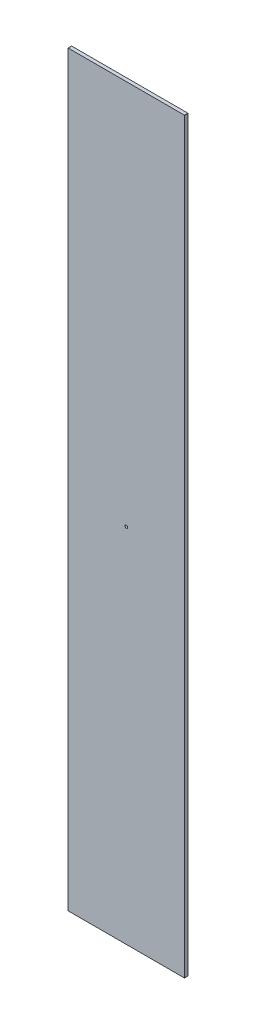
ISO-10303-21;
HEADER;
FILE_DESCRIPTION(('STEP AP214'),'2;1');
FILE_NAME('part.step','',(''),(''),'','','');
FILE_SCHEMA(('AUTOMOTIVE_DESIGN { 1 0 10303 214 1 1 1 1 }'));
ENDSEC;
DATA;
#1=APPLICATION_CONTEXT('core data for automotive mechanical design processes');
#2=APPLICATION_PROTOCOL_DEFINITION('international standard','automotive_design',2000,#1);
#3=PRODUCT_CONTEXT('',#1,'mechanical');
#4=PRODUCT('Part','Part','',(#3));
#5=PRODUCT_RELATED_PRODUCT_CATEGORY('part','',(#4));
#6=PRODUCT_DEFINITION_FORMATION('','',#4);
#7=PRODUCT_DEFINITION_CONTEXT('part definition',#1,'design');
#8=PRODUCT_DEFINITION('design','',#6,#7);
#9=PRODUCT_DEFINITION_SHAPE('','',#8);
#10=(LENGTH_UNIT() NAMED_UNIT(*) SI_UNIT(.MILLI.,.METRE.));
#11=(NAMED_UNIT(*) PLANE_ANGLE_UNIT() SI_UNIT($,.RADIAN.));
#12=(NAMED_UNIT(*) SI_UNIT($,.STERADIAN.) SOLID_ANGLE_UNIT());
#13=UNCERTAINTY_MEASURE_WITH_UNIT(LENGTH_MEASURE(1.E-05),#10,'distance_accuracy_value','');
#14=(GEOMETRIC_REPRESENTATION_CONTEXT(3) GLOBAL_UNCERTAINTY_ASSIGNED_CONTEXT((#13)) GLOBAL_UNIT_ASSIGNED_CONTEXT((#10,
#11,#12)) REPRESENTATION_CONTEXT('',''));
#15=CARTESIAN_POINT('',(0.,0.,0.));
#16=DIRECTION('',(0.,0.,1.));
#17=DIRECTION('',(1.,0.,0.));
#18=AXIS2_PLACEMENT_3D('',#15,#16,#17);
#19=CARTESIAN_POINT('',(-107.17079593887,-782.6375,6.35));
#20=DIRECTION('',(1.,0.,0.));
#21=DIRECTION('',(0.,0.,-1.));
#22=AXIS2_PLACEMENT_3D('',#19,#20,#21);
#23=PLANE('',#22);
#24=DIRECTION('',(0.,-1.,0.));
#25=VECTOR('',#24,1.);
#26=CARTESIAN_POINT('',(-107.17079593887,-782.6375,0.));
#27=LINE('',#26,#25);
#28=CARTESIAN_POINT('',(-107.17079593887,591.6041,0.));
#29=VERTEX_POINT('',#28);
#30=CARTESIAN_POINT('',(-107.17079593887,-782.3835,0.));
#31=VERTEX_POINT('',#30);
#32=EDGE_CURVE('E139',#29,#31,#27,.T.);
#33=ORIENTED_EDGE('',*,*,#32,.T.);
#34=DIRECTION('',(0.,0.,-1.));
#35=VECTOR('',#34,1.);
#36=CARTESIAN_POINT('',(-107.17079593887,-782.3835,6.35));
#37=LINE('',#36,#35);
#38=CARTESIAN_POINT('',(-107.17079593887,-782.3835,6.35));
#39=VERTEX_POINT('',#38);
#40=EDGE_CURVE('E114',#31,#39,#37,.F.);
#41=ORIENTED_EDGE('',*,*,#40,.T.);
#42=DIRECTION('',(0.,-1.,0.));
#43=VECTOR('',#42,1.);
#44=CARTESIAN_POINT('',(-107.17079593887,-782.6375,6.35));
#45=LINE('',#44,#43);
#46=CARTESIAN_POINT('',(-107.17079593887,591.6041,6.35));
#47=VERTEX_POINT('',#46);
#48=EDGE_CURVE('E153',#47,#39,#45,.T.);
#49=ORIENTED_EDGE('',*,*,#48,.F.);
#50=DIRECTION('',(0.,0.,-1.));
#51=VECTOR('',#50,1.);
#52=CARTESIAN_POINT('',(-107.17079593887,591.6041,6.35));
#53=LINE('',#52,#51);
#54=EDGE_CURVE('E120',#47,#29,#53,.T.);
#55=ORIENTED_EDGE('',*,*,#54,.T.);
#56=EDGE_LOOP('',(#33,#41,#49,#55));
#57=FACE_BOUND('',#56,.T.);
#58=ADVANCED_FACE('F42',(#57),#23,.F.);
#59=CARTESIAN_POINT('',(-107.17079593887,-782.6375,6.35));
#60=DIRECTION('',(0.,1.,0.));
#61=DIRECTION('',(0.,0.,1.));
#62=AXIS2_PLACEMENT_3D('',#59,#60,#61);
#63=PLANE('',#62);
#64=DIRECTION('',(1.,0.,0.));
#65=VECTOR('',#64,1.);
#66=CARTESIAN_POINT('',(-107.17079593887,-782.6375,6.35));
#67=LINE('',#66,#65);
#68=CARTESIAN_POINT('',(-106.91679593887,-782.6375,6.35));
#69=VERTEX_POINT('',#68);
#70=CARTESIAN_POINT('',(106.91679593887,-782.6375,6.35));
#71=VERTEX_POINT('',#70);
#72=EDGE_CURVE('E130',#69,#71,#67,.T.);
#73=ORIENTED_EDGE('',*,*,#72,.F.);
#74=DIRECTION('',(0.,0.,-1.));
#75=VECTOR('',#74,1.);
#76=CARTESIAN_POINT('',(-106.91679593887,-782.6375,6.35));
#77=LINE('',#76,#75);
#78=CARTESIAN_POINT('',(-106.91679593887,-782.6375,0.));
#79=VERTEX_POINT('',#78);
#80=EDGE_CURVE('E113',#69,#79,#77,.T.);
#81=ORIENTED_EDGE('',*,*,#80,.T.);
#82=DIRECTION('',(1.,0.,0.));
#83=VECTOR('',#82,1.);
#84=CARTESIAN_POINT('',(-107.17079593887,-782.6375,0.));
#85=LINE('',#84,#83);
#86=CARTESIAN_POINT('',(106.91679593887,-782.6375,0.));
#87=VERTEX_POINT('',#86);
#88=EDGE_CURVE('E127',#79,#87,#85,.T.);
#89=ORIENTED_EDGE('',*,*,#88,.T.);
#90=DIRECTION('',(0.,0.,-1.));
#91=VECTOR('',#90,1.);
#92=CARTESIAN_POINT('',(106.916795938871,-782.6375,6.35));
#93=LINE('',#92,#91);
#94=EDGE_CURVE('E133',#87,#71,#93,.F.);
#95=ORIENTED_EDGE('',*,*,#94,.T.);
#96=EDGE_LOOP('',(#73,#81,#89,#95));
#97=FACE_BOUND('',#96,.T.);
#98=ADVANCED_FACE('F126',(#97),#63,.F.);
#99=CARTESIAN_POINT('',(107.170795938871,-782.6375,6.35));
#100=DIRECTION('',(-1.,0.,0.));
#101=DIRECTION('',(0.,-1.,0.));
#102=AXIS2_PLACEMENT_3D('',#99,#100,#101);
#103=PLANE('',#102);
#104=DIRECTION('',(0.,1.,0.));
#105=VECTOR('',#104,1.);
#106=CARTESIAN_POINT('',(107.170795938871,-782.6375,6.35));
#107=LINE('',#106,#105);
#108=CARTESIAN_POINT('',(107.170795938871,-782.3835,6.35));
#109=VERTEX_POINT('',#108);
#110=CARTESIAN_POINT('',(107.17079593887,591.6041,6.35));
#111=VERTEX_POINT('',#110);
#112=EDGE_CURVE('E206',#109,#111,#107,.T.);
#113=ORIENTED_EDGE('',*,*,#112,.F.);
#114=DIRECTION('',(0.,0.,-1.));
#115=VECTOR('',#114,1.);
#116=CARTESIAN_POINT('',(107.170795938871,-782.3835,6.35));
#117=LINE('',#116,#115);
#118=CARTESIAN_POINT('',(107.170795938871,-782.3835,0.));
#119=VERTEX_POINT('',#118);
#120=EDGE_CURVE('E183',#109,#119,#117,.T.);
#121=ORIENTED_EDGE('',*,*,#120,.T.);
#122=DIRECTION('',(0.,1.,0.));
#123=VECTOR('',#122,1.);
#124=CARTESIAN_POINT('',(107.170795938871,-782.6375,0.));
#125=LINE('',#124,#123);
#126=CARTESIAN_POINT('',(107.17079593887,591.6041,0.));
#127=VERTEX_POINT('',#126);
#128=EDGE_CURVE('E138',#119,#127,#125,.T.);
#129=ORIENTED_EDGE('',*,*,#128,.T.);
#130=DIRECTION('',(0.,0.,-1.));
#131=VECTOR('',#130,1.);
#132=CARTESIAN_POINT('',(107.17079593887,591.6041,6.35));
#133=LINE('',#132,#131);
#134=EDGE_CURVE('E180',#127,#111,#133,.F.);
#135=ORIENTED_EDGE('',*,*,#134,.T.);
#136=EDGE_LOOP('',(#113,#121,#129,#135));
#137=FACE_BOUND('',#136,.T.);
#138=ADVANCED_FACE('F245',(#137),#103,.F.);
#139=CARTESIAN_POINT('',(-107.17079593887,591.8581,6.35));
#140=DIRECTION('',(0.,-1.,0.));
#141=DIRECTION('',(0.,0.,-1.));
#142=AXIS2_PLACEMENT_3D('',#139,#140,#141);
#143=PLANE('',#142);
#144=DIRECTION('',(-1.,0.,0.));
#145=VECTOR('',#144,1.);
#146=CARTESIAN_POINT('',(-107.17079593887,591.8581,6.35));
#147=LINE('',#146,#145);
#148=CARTESIAN_POINT('',(106.91679593887,591.8581,6.35));
#149=VERTEX_POINT('',#148);
#150=CARTESIAN_POINT('',(-106.91679593887,591.8581,6.35));
#151=VERTEX_POINT('',#150);
#152=EDGE_CURVE('E155',#149,#151,#147,.T.);
#153=ORIENTED_EDGE('',*,*,#152,.F.);
#154=DIRECTION('',(0.,0.,-1.));
#155=VECTOR('',#154,1.);
#156=CARTESIAN_POINT('',(106.91679593887,591.8581,6.35));
#157=LINE('',#156,#155);
#158=CARTESIAN_POINT('',(106.91679593887,591.8581,0.));
#159=VERTEX_POINT('',#158);
#160=EDGE_CURVE('E11',#149,#159,#157,.T.);
#161=ORIENTED_EDGE('',*,*,#160,.T.);
#162=DIRECTION('',(-1.,0.,0.));
#163=VECTOR('',#162,1.);
#164=CARTESIAN_POINT('',(-107.17079593887,591.8581,0.));
#165=LINE('',#164,#163);
#166=CARTESIAN_POINT('',(-106.91679593887,591.8581,0.));
#167=VERTEX_POINT('',#166);
#168=EDGE_CURVE('E145',#159,#167,#165,.T.);
#169=ORIENTED_EDGE('',*,*,#168,.T.);
#170=DIRECTION('',(0.,0.,-1.));
#171=VECTOR('',#170,1.);
#172=CARTESIAN_POINT('',(-106.91679593887,591.8581,6.35));
#173=LINE('',#172,#171);
#174=EDGE_CURVE('E51',#167,#151,#173,.F.);
#175=ORIENTED_EDGE('',*,*,#174,.T.);
#176=EDGE_LOOP('',(#153,#161,#169,#175));
#177=FACE_BOUND('',#176,.T.);
#178=ADVANCED_FACE('F238',(#177),#143,.F.);
#179=CARTESIAN_POINT('',(0.,0.,6.35));
#180=DIRECTION('',(0.,0.,-1.));
#181=DIRECTION('',(-1.,0.,0.));
#182=AXIS2_PLACEMENT_3D('',#179,#180,#181);
#183=PLANE('',#182);
#184=CARTESIAN_POINT('',(0.,-117.0813,6.35));
#185=DIRECTION('',(0.,0.,-1.));
#186=DIRECTION('',(-1.,0.,0.));
#187=AXIS2_PLACEMENT_3D('',#184,#185,#186);
#188=CIRCLE('',#187,2.54);
#189=CARTESIAN_POINT('',(-2.54,-117.0813,6.35));
#190=VERTEX_POINT('',#189);
#191=EDGE_CURVE('E147',#190,#190,#188,.T.);
#192=ORIENTED_EDGE('',*,*,#191,.T.);
#193=EDGE_LOOP('',(#192));
#194=FACE_BOUND('',#193,.T.);
#195=ORIENTED_EDGE('',*,*,#48,.T.);
#196=CARTESIAN_POINT('',(-106.91679593887,-782.3835,6.35));
#197=DIRECTION('',(0.,0.,-1.));
#198=DIRECTION('',(-1.,0.,0.));
#199=AXIS2_PLACEMENT_3D('',#196,#197,#198);
#200=CIRCLE('',#199,0.254);
#201=EDGE_CURVE('E177',#39,#69,#200,.F.);
#202=ORIENTED_EDGE('',*,*,#201,.T.);
#203=ORIENTED_EDGE('',*,*,#72,.T.);
#204=CARTESIAN_POINT('',(106.916795938871,-782.3835,6.35));
#205=DIRECTION('',(0.,0.,-1.));
#206=DIRECTION('',(-1.,0.,0.));
#207=AXIS2_PLACEMENT_3D('',#204,#205,#206);
#208=CIRCLE('',#207,0.254);
#209=EDGE_CURVE('E174',#71,#109,#208,.F.);
#210=ORIENTED_EDGE('',*,*,#209,.T.);
#211=ORIENTED_EDGE('',*,*,#112,.T.);
#212=CARTESIAN_POINT('',(106.91679593887,591.6041,6.35));
#213=DIRECTION('',(0.,0.,-1.));
#214=DIRECTION('',(-1.,0.,0.));
#215=AXIS2_PLACEMENT_3D('',#212,#213,#214);
#216=CIRCLE('',#215,0.254);
#217=EDGE_CURVE('E64',#111,#149,#216,.F.);
#218=ORIENTED_EDGE('',*,*,#217,.T.);
#219=ORIENTED_EDGE('',*,*,#152,.T.);
#220=CARTESIAN_POINT('',(-106.91679593887,591.6041,6.35));
#221=DIRECTION('',(0.,0.,-1.));
#222=DIRECTION('',(-1.,0.,0.));
#223=AXIS2_PLACEMENT_3D('',#220,#221,#222);
#224=CIRCLE('',#223,0.254);
#225=EDGE_CURVE('E169',#151,#47,#224,.F.);
#226=ORIENTED_EDGE('',*,*,#225,.T.);
#227=EDGE_LOOP('',(#195,#202,#203,#210,#211,#218,#219,#226));
#228=FACE_BOUND('',#227,.T.);
#229=ADVANCED_FACE('F236',(#194,#228),#183,.F.);
#230=CARTESIAN_POINT('',(0.,0.,0.));
#231=DIRECTION('',(0.,0.,-1.));
#232=DIRECTION('',(-1.,0.,0.));
#233=AXIS2_PLACEMENT_3D('',#230,#231,#232);
#234=PLANE('',#233);
#235=CARTESIAN_POINT('',(0.,-117.0813,0.));
#236=DIRECTION('',(0.,0.,1.));
#237=DIRECTION('',(1.,0.,0.));
#238=AXIS2_PLACEMENT_3D('',#235,#236,#237);
#239=CIRCLE('',#238,2.54);
#240=CARTESIAN_POINT('',(2.54,-117.0813,0.));
#241=VERTEX_POINT('',#240);
#242=EDGE_CURVE('E223',#241,#241,#239,.T.);
#243=ORIENTED_EDGE('',*,*,#242,.T.);
#244=EDGE_LOOP('',(#243));
#245=FACE_BOUND('',#244,.T.);
#246=ORIENTED_EDGE('',*,*,#88,.F.);
#247=CARTESIAN_POINT('',(-106.91679593887,-782.3835,0.));
#248=DIRECTION('',(0.,0.,-1.));
#249=DIRECTION('',(-1.,0.,0.));
#250=AXIS2_PLACEMENT_3D('',#247,#248,#249);
#251=CIRCLE('',#250,0.254);
#252=EDGE_CURVE('E109',#79,#31,#251,.T.);
#253=ORIENTED_EDGE('',*,*,#252,.T.);
#254=ORIENTED_EDGE('',*,*,#32,.F.);
#255=CARTESIAN_POINT('',(-106.91679593887,591.6041,0.));
#256=DIRECTION('',(0.,0.,-1.));
#257=DIRECTION('',(-1.,0.,0.));
#258=AXIS2_PLACEMENT_3D('',#255,#256,#257);
#259=CIRCLE('',#258,0.254);
#260=EDGE_CURVE('E132',#29,#167,#259,.T.);
#261=ORIENTED_EDGE('',*,*,#260,.T.);
#262=ORIENTED_EDGE('',*,*,#168,.F.);
#263=CARTESIAN_POINT('',(106.91679593887,591.6041,0.));
#264=DIRECTION('',(0.,0.,-1.));
#265=DIRECTION('',(-1.,0.,0.));
#266=AXIS2_PLACEMENT_3D('',#263,#264,#265);
#267=CIRCLE('',#266,0.254);
#268=EDGE_CURVE('E159',#159,#127,#267,.T.);
#269=ORIENTED_EDGE('',*,*,#268,.T.);
#270=ORIENTED_EDGE('',*,*,#128,.F.);
#271=CARTESIAN_POINT('',(106.916795938871,-782.3835,0.));
#272=DIRECTION('',(0.,0.,-1.));
#273=DIRECTION('',(-1.,0.,0.));
#274=AXIS2_PLACEMENT_3D('',#271,#272,#273);
#275=CIRCLE('',#274,0.254);
#276=EDGE_CURVE('E121',#119,#87,#275,.T.);
#277=ORIENTED_EDGE('',*,*,#276,.T.);
#278=EDGE_LOOP('',(#246,#253,#254,#261,#262,#269,#270,#277));
#279=FACE_BOUND('',#278,.T.);
#280=ADVANCED_FACE('F135',(#245,#279),#234,.T.);
#281=CARTESIAN_POINT('',(-106.91679593887,-782.3835,6.35));
#282=DIRECTION('',(0.,0.,-1.));
#283=DIRECTION('',(-1.,0.,0.));
#284=AXIS2_PLACEMENT_3D('',#281,#282,#283);
#285=CYLINDRICAL_SURFACE('',#284,0.254);
#286=ORIENTED_EDGE('',*,*,#201,.F.);
#287=ORIENTED_EDGE('',*,*,#40,.F.);
#288=ORIENTED_EDGE('',*,*,#252,.F.);
#289=ORIENTED_EDGE('',*,*,#80,.F.);
#290=EDGE_LOOP('',(#286,#287,#288,#289));
#291=FACE_BOUND('',#290,.T.);
#292=ADVANCED_FACE('F112',(#291),#285,.T.);
#293=CARTESIAN_POINT('',(106.916795938871,-782.3835,6.35));
#294=DIRECTION('',(0.,0.,-1.));
#295=DIRECTION('',(-1.,0.,0.));
#296=AXIS2_PLACEMENT_3D('',#293,#294,#295);
#297=CYLINDRICAL_SURFACE('',#296,0.254);
#298=ORIENTED_EDGE('',*,*,#209,.F.);
#299=ORIENTED_EDGE('',*,*,#94,.F.);
#300=ORIENTED_EDGE('',*,*,#276,.F.);
#301=ORIENTED_EDGE('',*,*,#120,.F.);
#302=EDGE_LOOP('',(#298,#299,#300,#301));
#303=FACE_BOUND('',#302,.T.);
#304=ADVANCED_FACE('F258',(#303),#297,.T.);
#305=CARTESIAN_POINT('',(106.91679593887,591.6041,6.35));
#306=DIRECTION('',(0.,0.,-1.));
#307=DIRECTION('',(-1.,0.,0.));
#308=AXIS2_PLACEMENT_3D('',#305,#306,#307);
#309=CYLINDRICAL_SURFACE('',#308,0.254);
#310=ORIENTED_EDGE('',*,*,#217,.F.);
#311=ORIENTED_EDGE('',*,*,#134,.F.);
#312=ORIENTED_EDGE('',*,*,#268,.F.);
#313=ORIENTED_EDGE('',*,*,#160,.F.);
#314=EDGE_LOOP('',(#310,#311,#312,#313));
#315=FACE_BOUND('',#314,.T.);
#316=ADVANCED_FACE('F260',(#315),#309,.T.);
#317=CARTESIAN_POINT('',(-106.91679593887,591.6041,6.35));
#318=DIRECTION('',(0.,0.,-1.));
#319=DIRECTION('',(-1.,0.,0.));
#320=AXIS2_PLACEMENT_3D('',#317,#318,#319);
#321=CYLINDRICAL_SURFACE('',#320,0.254);
#322=ORIENTED_EDGE('',*,*,#225,.F.);
#323=ORIENTED_EDGE('',*,*,#174,.F.);
#324=ORIENTED_EDGE('',*,*,#260,.F.);
#325=ORIENTED_EDGE('',*,*,#54,.F.);
#326=EDGE_LOOP('',(#322,#323,#324,#325));
#327=FACE_BOUND('',#326,.T.);
#328=ADVANCED_FACE('F44',(#327),#321,.T.);
#329=CARTESIAN_POINT('',(0.,-117.0813,0.));
#330=DIRECTION('',(0.,0.,1.));
#331=DIRECTION('',(1.,0.,0.));
#332=AXIS2_PLACEMENT_3D('',#329,#330,#331);
#333=CYLINDRICAL_SURFACE('',#332,2.54);
#334=ORIENTED_EDGE('',*,*,#242,.F.);
#335=EDGE_LOOP('',(#334));
#336=FACE_BOUND('',#335,.T.);
#337=ORIENTED_EDGE('',*,*,#191,.F.);
#338=EDGE_LOOP('',(#337));
#339=FACE_BOUND('',#338,.T.);
#340=ADVANCED_FACE('F230',(#336,#339),#333,.F.);
#341=CLOSED_SHELL('',(#58,#98,#138,#178,#229,#280,#292,#304,#316,#328,#340));
#342=MANIFOLD_SOLID_BREP('B2',#341);
#343=ADVANCED_BREP_SHAPE_REPRESENTATION('',(#18,#342),#14);
#344=SHAPE_DEFINITION_REPRESENTATION(#9,#343);
ENDSEC;
END-ISO-10303-21;
